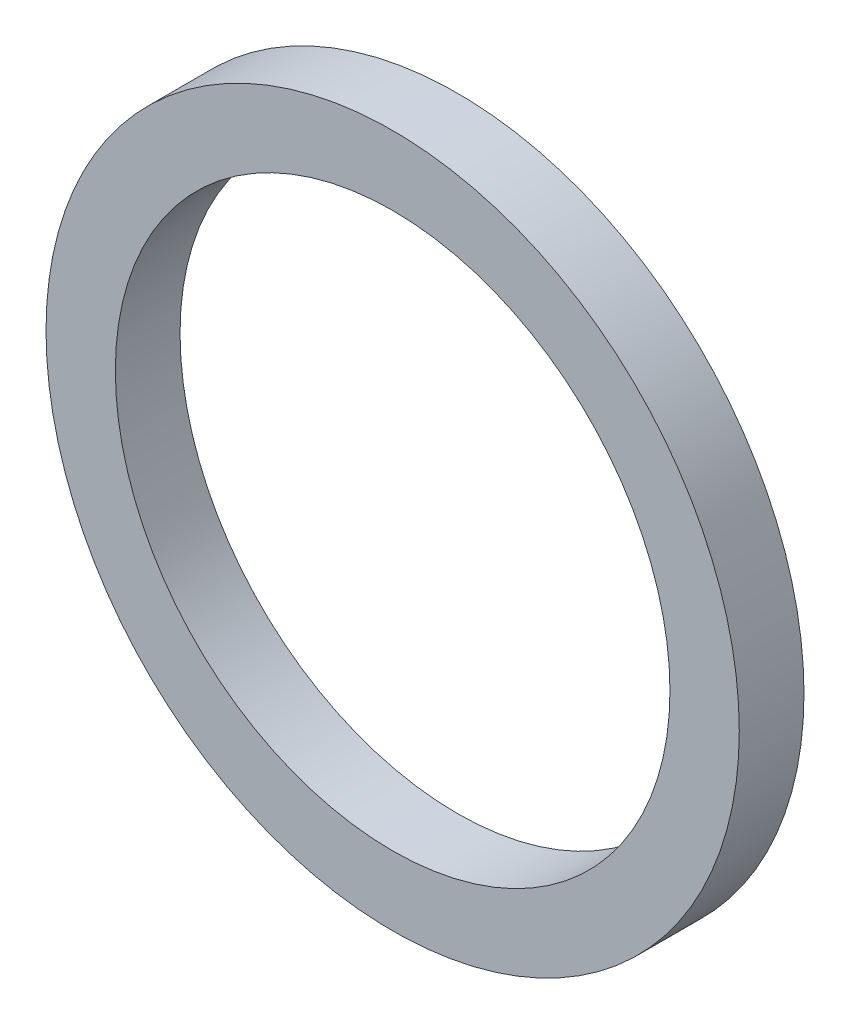
ISO-10303-21;
HEADER;
FILE_DESCRIPTION(('STEP AP214'),'2;1');
FILE_NAME('part.step','',(''),(''),'','','');
FILE_SCHEMA(('AUTOMOTIVE_DESIGN { 1 0 10303 214 1 1 1 1 }'));
ENDSEC;
DATA;
#1=APPLICATION_CONTEXT('core data for automotive mechanical design processes');
#2=APPLICATION_PROTOCOL_DEFINITION('international standard','automotive_design',2000,#1);
#3=PRODUCT_CONTEXT('',#1,'mechanical');
#4=PRODUCT('Part','Part','',(#3));
#5=PRODUCT_RELATED_PRODUCT_CATEGORY('part','',(#4));
#6=PRODUCT_DEFINITION_FORMATION('','',#4);
#7=PRODUCT_DEFINITION_CONTEXT('part definition',#1,'design');
#8=PRODUCT_DEFINITION('design','',#6,#7);
#9=PRODUCT_DEFINITION_SHAPE('','',#8);
#10=(LENGTH_UNIT() NAMED_UNIT(*) SI_UNIT(.MILLI.,.METRE.));
#11=(NAMED_UNIT(*) PLANE_ANGLE_UNIT() SI_UNIT($,.RADIAN.));
#12=(NAMED_UNIT(*) SI_UNIT($,.STERADIAN.) SOLID_ANGLE_UNIT());
#13=UNCERTAINTY_MEASURE_WITH_UNIT(LENGTH_MEASURE(1.E-05),#10,'distance_accuracy_value','');
#14=(GEOMETRIC_REPRESENTATION_CONTEXT(3) GLOBAL_UNCERTAINTY_ASSIGNED_CONTEXT((#13)) GLOBAL_UNIT_ASSIGNED_CONTEXT((#10,
#11,#12)) REPRESENTATION_CONTEXT('',''));
#15=CARTESIAN_POINT('',(0.,0.,0.));
#16=DIRECTION('',(0.,0.,1.));
#17=DIRECTION('',(1.,0.,0.));
#18=AXIS2_PLACEMENT_3D('',#15,#16,#17);
#19=CARTESIAN_POINT('',(0.,0.,7.));
#20=DIRECTION('',(0.,0.,1.));
#21=DIRECTION('',(1.,0.,0.));
#22=AXIS2_PLACEMENT_3D('',#19,#20,#21);
#23=PLANE('',#22);
#24=CARTESIAN_POINT('',(0.,0.,7.));
#25=DIRECTION('',(0.,0.,1.));
#26=DIRECTION('',(1.,0.,0.));
#27=AXIS2_PLACEMENT_3D('',#24,#25,#26);
#28=CIRCLE('',#27,37.5);
#29=CARTESIAN_POINT('',(37.5,0.,7.));
#30=VERTEX_POINT('',#29);
#31=EDGE_CURVE('E10',#30,#30,#28,.T.);
#32=ORIENTED_EDGE('',*,*,#31,.T.);
#33=EDGE_LOOP('',(#32));
#34=FACE_BOUND('',#33,.T.);
#35=CARTESIAN_POINT('',(0.,0.,7.));
#36=DIRECTION('',(0.,0.,1.));
#37=DIRECTION('',(1.,0.,0.));
#38=AXIS2_PLACEMENT_3D('',#35,#36,#37);
#39=CIRCLE('',#38,30.);
#40=CARTESIAN_POINT('',(30.,0.,7.));
#41=VERTEX_POINT('',#40);
#42=EDGE_CURVE('E53',#41,#41,#39,.T.);
#43=ORIENTED_EDGE('',*,*,#42,.F.);
#44=EDGE_LOOP('',(#43));
#45=FACE_BOUND('',#44,.T.);
#46=ADVANCED_FACE('F42',(#34,#45),#23,.T.);
#47=CARTESIAN_POINT('',(0.,0.,0.));
#48=DIRECTION('',(0.,0.,1.));
#49=DIRECTION('',(1.,0.,0.));
#50=AXIS2_PLACEMENT_3D('',#47,#48,#49);
#51=PLANE('',#50);
#52=CARTESIAN_POINT('',(0.,0.,0.));
#53=DIRECTION('',(0.,0.,1.));
#54=DIRECTION('',(1.,0.,0.));
#55=AXIS2_PLACEMENT_3D('',#52,#53,#54);
#56=CIRCLE('',#55,37.5);
#57=CARTESIAN_POINT('',(37.5,0.,0.));
#58=VERTEX_POINT('',#57);
#59=EDGE_CURVE('E46',#58,#58,#56,.T.);
#60=ORIENTED_EDGE('',*,*,#59,.F.);
#61=EDGE_LOOP('',(#60));
#62=FACE_BOUND('',#61,.T.);
#63=CARTESIAN_POINT('',(0.,0.,0.));
#64=DIRECTION('',(0.,0.,1.));
#65=DIRECTION('',(1.,0.,0.));
#66=AXIS2_PLACEMENT_3D('',#63,#64,#65);
#67=CIRCLE('',#66,30.);
#68=CARTESIAN_POINT('',(30.,0.,0.));
#69=VERTEX_POINT('',#68);
#70=EDGE_CURVE('E55',#69,#69,#67,.T.);
#71=ORIENTED_EDGE('',*,*,#70,.T.);
#72=EDGE_LOOP('',(#71));
#73=FACE_BOUND('',#72,.T.);
#74=ADVANCED_FACE('F64',(#62,#73),#51,.F.);
#75=CARTESIAN_POINT('',(0.,0.,7.));
#76=DIRECTION('',(0.,0.,-1.));
#77=DIRECTION('',(-1.,0.,0.));
#78=AXIS2_PLACEMENT_3D('',#75,#76,#77);
#79=CYLINDRICAL_SURFACE('',#78,37.5);
#80=ORIENTED_EDGE('',*,*,#31,.F.);
#81=EDGE_LOOP('',(#80));
#82=FACE_BOUND('',#81,.T.);
#83=ORIENTED_EDGE('',*,*,#59,.T.);
#84=EDGE_LOOP('',(#83));
#85=FACE_BOUND('',#84,.T.);
#86=ADVANCED_FACE('F44',(#82,#85),#79,.T.);
#87=CARTESIAN_POINT('',(0.,0.,7.));
#88=DIRECTION('',(0.,0.,-1.));
#89=DIRECTION('',(-1.,0.,0.));
#90=AXIS2_PLACEMENT_3D('',#87,#88,#89);
#91=CYLINDRICAL_SURFACE('',#90,30.);
#92=ORIENTED_EDGE('',*,*,#42,.T.);
#93=EDGE_LOOP('',(#92));
#94=FACE_BOUND('',#93,.T.);
#95=ORIENTED_EDGE('',*,*,#70,.F.);
#96=EDGE_LOOP('',(#95));
#97=FACE_BOUND('',#96,.T.);
#98=ADVANCED_FACE('F61',(#94,#97),#91,.F.);
#99=CLOSED_SHELL('',(#46,#74,#86,#98));
#100=MANIFOLD_SOLID_BREP('B2',#99);
#101=ADVANCED_BREP_SHAPE_REPRESENTATION('',(#18,#100),#14);
#102=SHAPE_DEFINITION_REPRESENTATION(#9,#101);
ENDSEC;
END-ISO-10303-21;
